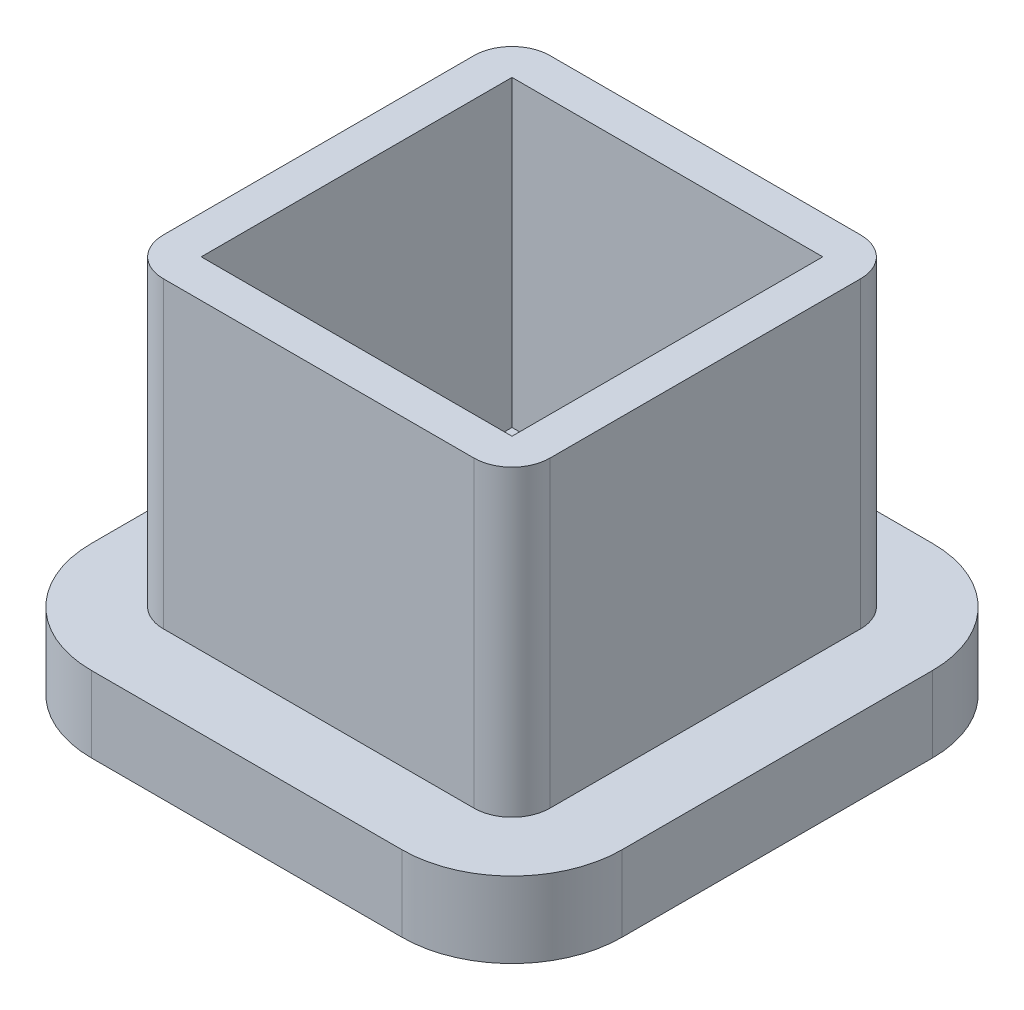
ISO-10303-21;
HEADER;
FILE_DESCRIPTION(('STEP AP214'),'2;1');
FILE_NAME('part.step','',(''),(''),'','','');
FILE_SCHEMA(('AUTOMOTIVE_DESIGN { 1 0 10303 214 1 1 1 1 }'));
ENDSEC;
DATA;
#1=APPLICATION_CONTEXT('core data for automotive mechanical design processes');
#2=APPLICATION_PROTOCOL_DEFINITION('international standard','automotive_design',2000,#1);
#3=PRODUCT_CONTEXT('',#1,'mechanical');
#4=PRODUCT('Part','Part','',(#3));
#5=PRODUCT_RELATED_PRODUCT_CATEGORY('part','',(#4));
#6=PRODUCT_DEFINITION_FORMATION('','',#4);
#7=PRODUCT_DEFINITION_CONTEXT('part definition',#1,'design');
#8=PRODUCT_DEFINITION('design','',#6,#7);
#9=PRODUCT_DEFINITION_SHAPE('','',#8);
#10=(LENGTH_UNIT() NAMED_UNIT(*) SI_UNIT(.MILLI.,.METRE.));
#11=(NAMED_UNIT(*) PLANE_ANGLE_UNIT() SI_UNIT($,.RADIAN.));
#12=(NAMED_UNIT(*) SI_UNIT($,.STERADIAN.) SOLID_ANGLE_UNIT());
#13=UNCERTAINTY_MEASURE_WITH_UNIT(LENGTH_MEASURE(1.E-05),#10,'distance_accuracy_value','');
#14=(GEOMETRIC_REPRESENTATION_CONTEXT(3) GLOBAL_UNCERTAINTY_ASSIGNED_CONTEXT((#13)) GLOBAL_UNIT_ASSIGNED_CONTEXT((#10,
#11,#12)) REPRESENTATION_CONTEXT('',''));
#15=CARTESIAN_POINT('',(0.,0.,0.));
#16=DIRECTION('',(0.,0.,1.));
#17=DIRECTION('',(1.,0.,0.));
#18=AXIS2_PLACEMENT_3D('',#15,#16,#17);
#19=CARTESIAN_POINT('',(0.,5.,0.));
#20=DIRECTION('',(0.,1.,0.));
#21=DIRECTION('',(0.,0.,1.));
#22=AXIS2_PLACEMENT_3D('',#19,#20,#21);
#23=PLANE('',#22);
#24=DIRECTION('',(0.,0.,1.));
#25=VECTOR('',#24,1.);
#26=CARTESIAN_POINT('',(-28.1933422806209,5.,24.5146348700407));
#27=LINE('',#26,#25);
#28=CARTESIAN_POINT('',(-28.1933422806209,5.,-3.23536512995933));
#29=VERTEX_POINT('',#28);
#30=CARTESIAN_POINT('',(-28.1933422806209,5.,17.2646348700407));
#31=VERTEX_POINT('',#30);
#32=EDGE_CURVE('E246',#29,#31,#27,.T.);
#33=ORIENTED_EDGE('',*,*,#32,.T.);
#34=CARTESIAN_POINT('',(-20.9433422806209,5.,17.2646348700407));
#35=DIRECTION('',(0.,1.,0.));
#36=DIRECTION('',(0.,0.,1.));
#37=AXIS2_PLACEMENT_3D('',#34,#35,#36);
#38=CIRCLE('',#37,7.25);
#39=CARTESIAN_POINT('',(-20.9433422806209,5.,24.5146348700407));
#40=VERTEX_POINT('',#39);
#41=EDGE_CURVE('E286',#31,#40,#38,.T.);
#42=ORIENTED_EDGE('',*,*,#41,.T.);
#43=DIRECTION('',(1.,0.,0.));
#44=VECTOR('',#43,1.);
#45=CARTESIAN_POINT('',(6.80665771937911,5.,24.5146348700407));
#46=LINE('',#45,#44);
#47=CARTESIAN_POINT('',(-0.443342280620896,5.,24.5146348700407));
#48=VERTEX_POINT('',#47);
#49=EDGE_CURVE('E249',#40,#48,#46,.T.);
#50=ORIENTED_EDGE('',*,*,#49,.T.);
#51=CARTESIAN_POINT('',(-0.443342280620896,5.,17.2646348700407));
#52=DIRECTION('',(0.,1.,0.));
#53=DIRECTION('',(0.,0.,1.));
#54=AXIS2_PLACEMENT_3D('',#51,#52,#53);
#55=CIRCLE('',#54,7.25);
#56=CARTESIAN_POINT('',(6.80665771937911,5.,17.2646348700407));
#57=VERTEX_POINT('',#56);
#58=EDGE_CURVE('E282',#48,#57,#55,.T.);
#59=ORIENTED_EDGE('',*,*,#58,.T.);
#60=DIRECTION('',(0.,0.,-1.));
#61=VECTOR('',#60,1.);
#62=CARTESIAN_POINT('',(6.80665771937911,5.,24.5146348700407));
#63=LINE('',#62,#61);
#64=CARTESIAN_POINT('',(6.80665771937911,5.,-3.23536512995933));
#65=VERTEX_POINT('',#64);
#66=EDGE_CURVE('E239',#57,#65,#63,.T.);
#67=ORIENTED_EDGE('',*,*,#66,.T.);
#68=CARTESIAN_POINT('',(-0.443342280620896,5.,-3.23536512995933));
#69=DIRECTION('',(0.,1.,0.));
#70=DIRECTION('',(0.,0.,1.));
#71=AXIS2_PLACEMENT_3D('',#68,#69,#70);
#72=CIRCLE('',#71,7.25);
#73=CARTESIAN_POINT('',(-0.443342280620896,5.,-10.4853651299593));
#74=VERTEX_POINT('',#73);
#75=EDGE_CURVE('E280',#65,#74,#72,.T.);
#76=ORIENTED_EDGE('',*,*,#75,.T.);
#77=DIRECTION('',(-1.,0.,0.));
#78=VECTOR('',#77,1.);
#79=CARTESIAN_POINT('',(6.80665771937911,5.,-10.4853651299593));
#80=LINE('',#79,#78);
#81=CARTESIAN_POINT('',(-20.9433422806209,5.,-10.4853651299593));
#82=VERTEX_POINT('',#81);
#83=EDGE_CURVE('E242',#74,#82,#80,.T.);
#84=ORIENTED_EDGE('',*,*,#83,.T.);
#85=CARTESIAN_POINT('',(-20.9433422806209,5.,-3.23536512995933));
#86=DIRECTION('',(0.,1.,0.));
#87=DIRECTION('',(0.,0.,1.));
#88=AXIS2_PLACEMENT_3D('',#85,#86,#87);
#89=CIRCLE('',#88,7.25);
#90=EDGE_CURVE('E284',#82,#29,#89,.T.);
#91=ORIENTED_EDGE('',*,*,#90,.T.);
#92=EDGE_LOOP('',(#33,#42,#50,#59,#67,#76,#84,#91));
#93=FACE_BOUND('',#92,.T.);
#94=DIRECTION('',(1.,0.,0.));
#95=VECTOR('',#94,1.);
#96=CARTESIAN_POINT('',(-23.4433422806209,5.,19.7646348700407));
#97=LINE('',#96,#95);
#98=CARTESIAN_POINT('',(-20.9433422806209,5.,19.7646348700407));
#99=VERTEX_POINT('',#98);
#100=CARTESIAN_POINT('',(-0.44334228062089,5.,19.7646348700407));
#101=VERTEX_POINT('',#100);
#102=EDGE_CURVE('E232',#99,#101,#97,.T.);
#103=ORIENTED_EDGE('',*,*,#102,.F.);
#104=CARTESIAN_POINT('',(-20.9433422806209,5.,17.2646348700407));
#105=DIRECTION('',(0.,1.,0.));
#106=DIRECTION('',(0.,0.,1.));
#107=AXIS2_PLACEMENT_3D('',#104,#105,#106);
#108=CIRCLE('',#107,2.5);
#109=CARTESIAN_POINT('',(-23.4433422806209,5.,17.2646348700407));
#110=VERTEX_POINT('',#109);
#111=EDGE_CURVE('E325',#99,#110,#108,.F.);
#112=ORIENTED_EDGE('',*,*,#111,.T.);
#113=DIRECTION('',(0.,0.,1.));
#114=VECTOR('',#113,1.);
#115=CARTESIAN_POINT('',(-23.4433422806209,5.,-5.73536512995933));
#116=LINE('',#115,#114);
#117=CARTESIAN_POINT('',(-23.4433422806209,5.,-3.23536512995933));
#118=VERTEX_POINT('',#117);
#119=EDGE_CURVE('E193',#118,#110,#116,.T.);
#120=ORIENTED_EDGE('',*,*,#119,.F.);
#121=CARTESIAN_POINT('',(-20.9433422806209,5.,-3.23536512995933));
#122=DIRECTION('',(0.,1.,0.));
#123=DIRECTION('',(0.,0.,1.));
#124=AXIS2_PLACEMENT_3D('',#121,#122,#123);
#125=CIRCLE('',#124,2.5);
#126=CARTESIAN_POINT('',(-20.9433422806209,5.,-5.73536512995933));
#127=VERTEX_POINT('',#126);
#128=EDGE_CURVE('E11',#118,#127,#125,.F.);
#129=ORIENTED_EDGE('',*,*,#128,.T.);
#130=DIRECTION('',(-1.,0.,0.));
#131=VECTOR('',#130,1.);
#132=CARTESIAN_POINT('',(-23.4433422806209,5.,-5.73536512995933));
#133=LINE('',#132,#131);
#134=CARTESIAN_POINT('',(-0.443342280620894,5.,-5.73536512995933));
#135=VERTEX_POINT('',#134);
#136=EDGE_CURVE('E220',#135,#127,#133,.T.);
#137=ORIENTED_EDGE('',*,*,#136,.F.);
#138=CARTESIAN_POINT('',(-0.443342280620894,5.,-3.23536512995933));
#139=DIRECTION('',(0.,1.,0.));
#140=DIRECTION('',(0.,0.,1.));
#141=AXIS2_PLACEMENT_3D('',#138,#139,#140);
#142=CIRCLE('',#141,2.5);
#143=CARTESIAN_POINT('',(2.05665771937911,5.,-3.23536512995933));
#144=VERTEX_POINT('',#143);
#145=EDGE_CURVE('E45',#135,#144,#142,.F.);
#146=ORIENTED_EDGE('',*,*,#145,.T.);
#147=DIRECTION('',(0.,0.,-1.));
#148=VECTOR('',#147,1.);
#149=CARTESIAN_POINT('',(2.0566577193791,5.,-5.73536512995933));
#150=LINE('',#149,#148);
#151=CARTESIAN_POINT('',(2.05665771937911,5.,17.2646348700407));
#152=VERTEX_POINT('',#151);
#153=EDGE_CURVE('E235',#152,#144,#150,.T.);
#154=ORIENTED_EDGE('',*,*,#153,.F.);
#155=CARTESIAN_POINT('',(-0.443342280620892,5.,17.2646348700407));
#156=DIRECTION('',(0.,1.,0.));
#157=DIRECTION('',(0.,0.,1.));
#158=AXIS2_PLACEMENT_3D('',#155,#156,#157);
#159=CIRCLE('',#158,2.5);
#160=EDGE_CURVE('E327',#152,#101,#159,.F.);
#161=ORIENTED_EDGE('',*,*,#160,.T.);
#162=EDGE_LOOP('',(#103,#112,#120,#129,#137,#146,#154,#161));
#163=FACE_BOUND('',#162,.T.);
#164=ADVANCED_FACE('F37',(#93,#163),#23,.T.);
#165=CARTESIAN_POINT('',(6.80665771937911,5.,24.5146348700407));
#166=DIRECTION('',(-1.,0.,0.));
#167=DIRECTION('',(0.,0.,1.));
#168=AXIS2_PLACEMENT_3D('',#165,#166,#167);
#169=PLANE('',#168);
#170=ORIENTED_EDGE('',*,*,#66,.F.);
#171=DIRECTION('',(0.,-1.,0.));
#172=VECTOR('',#171,1.);
#173=CARTESIAN_POINT('',(6.80665771937911,5.,17.2646348700407));
#174=LINE('',#173,#172);
#175=CARTESIAN_POINT('',(6.80665771937911,0.,17.2646348700407));
#176=VERTEX_POINT('',#175);
#177=EDGE_CURVE('E295',#57,#176,#174,.T.);
#178=ORIENTED_EDGE('',*,*,#177,.T.);
#179=DIRECTION('',(0.,0.,-1.));
#180=VECTOR('',#179,1.);
#181=CARTESIAN_POINT('',(6.80665771937911,0.,24.5146348700407));
#182=LINE('',#181,#180);
#183=CARTESIAN_POINT('',(6.80665771937911,0.,-3.23536512995933));
#184=VERTEX_POINT('',#183);
#185=EDGE_CURVE('E229',#176,#184,#182,.T.);
#186=ORIENTED_EDGE('',*,*,#185,.T.);
#187=DIRECTION('',(0.,-1.,0.));
#188=VECTOR('',#187,1.);
#189=CARTESIAN_POINT('',(6.80665771937911,5.,-3.23536512995933));
#190=LINE('',#189,#188);
#191=EDGE_CURVE('E293',#184,#65,#190,.F.);
#192=ORIENTED_EDGE('',*,*,#191,.T.);
#193=EDGE_LOOP('',(#170,#178,#186,#192));
#194=FACE_BOUND('',#193,.T.);
#195=ADVANCED_FACE('F368',(#194),#169,.F.);
#196=CARTESIAN_POINT('',(6.80665771937911,5.,-10.4853651299593));
#197=DIRECTION('',(0.,0.,1.));
#198=DIRECTION('',(1.,0.,0.));
#199=AXIS2_PLACEMENT_3D('',#196,#197,#198);
#200=PLANE('',#199);
#201=DIRECTION('',(-1.,0.,0.));
#202=VECTOR('',#201,1.);
#203=CARTESIAN_POINT('',(6.80665771937911,0.,-10.4853651299593));
#204=LINE('',#203,#202);
#205=CARTESIAN_POINT('',(-0.443342280620896,0.,-10.4853651299593));
#206=VERTEX_POINT('',#205);
#207=CARTESIAN_POINT('',(-20.9433422806209,0.,-10.4853651299593));
#208=VERTEX_POINT('',#207);
#209=EDGE_CURVE('E255',#206,#208,#204,.T.);
#210=ORIENTED_EDGE('',*,*,#209,.T.);
#211=DIRECTION('',(0.,-1.,0.));
#212=VECTOR('',#211,1.);
#213=CARTESIAN_POINT('',(-20.9433422806209,5.,-10.4853651299593));
#214=LINE('',#213,#212);
#215=EDGE_CURVE('E291',#208,#82,#214,.F.);
#216=ORIENTED_EDGE('',*,*,#215,.T.);
#217=ORIENTED_EDGE('',*,*,#83,.F.);
#218=DIRECTION('',(0.,-1.,0.));
#219=VECTOR('',#218,1.);
#220=CARTESIAN_POINT('',(-0.443342280620896,5.,-10.4853651299593));
#221=LINE('',#220,#219);
#222=EDGE_CURVE('E288',#74,#206,#221,.T.);
#223=ORIENTED_EDGE('',*,*,#222,.T.);
#224=EDGE_LOOP('',(#210,#216,#217,#223));
#225=FACE_BOUND('',#224,.T.);
#226=ADVANCED_FACE('F375',(#225),#200,.F.);
#227=CARTESIAN_POINT('',(-28.1933422806209,5.,24.5146348700407));
#228=DIRECTION('',(1.,0.,0.));
#229=DIRECTION('',(0.,0.,-1.));
#230=AXIS2_PLACEMENT_3D('',#227,#228,#229);
#231=PLANE('',#230);
#232=DIRECTION('',(0.,0.,1.));
#233=VECTOR('',#232,1.);
#234=CARTESIAN_POINT('',(-28.1933422806209,0.,24.5146348700407));
#235=LINE('',#234,#233);
#236=CARTESIAN_POINT('',(-28.1933422806209,0.,-3.23536512995933));
#237=VERTEX_POINT('',#236);
#238=CARTESIAN_POINT('',(-28.1933422806209,0.,17.2646348700407));
#239=VERTEX_POINT('',#238);
#240=EDGE_CURVE('E258',#237,#239,#235,.T.);
#241=ORIENTED_EDGE('',*,*,#240,.T.);
#242=DIRECTION('',(0.,-1.,0.));
#243=VECTOR('',#242,1.);
#244=CARTESIAN_POINT('',(-28.1933422806209,5.,17.2646348700407));
#245=LINE('',#244,#243);
#246=EDGE_CURVE('E278',#239,#31,#245,.F.);
#247=ORIENTED_EDGE('',*,*,#246,.T.);
#248=ORIENTED_EDGE('',*,*,#32,.F.);
#249=DIRECTION('',(0.,-1.,0.));
#250=VECTOR('',#249,1.);
#251=CARTESIAN_POINT('',(-28.1933422806209,5.,-3.23536512995933));
#252=LINE('',#251,#250);
#253=EDGE_CURVE('E275',#29,#237,#252,.T.);
#254=ORIENTED_EDGE('',*,*,#253,.T.);
#255=EDGE_LOOP('',(#241,#247,#248,#254));
#256=FACE_BOUND('',#255,.T.);
#257=ADVANCED_FACE('F473',(#256),#231,.F.);
#258=CARTESIAN_POINT('',(6.80665771937911,5.,24.5146348700407));
#259=DIRECTION('',(0.,0.,-1.));
#260=DIRECTION('',(-1.,0.,0.));
#261=AXIS2_PLACEMENT_3D('',#258,#259,#260);
#262=PLANE('',#261);
#263=ORIENTED_EDGE('',*,*,#49,.F.);
#264=DIRECTION('',(0.,-1.,0.));
#265=VECTOR('',#264,1.);
#266=CARTESIAN_POINT('',(-20.9433422806209,5.,24.5146348700407));
#267=LINE('',#266,#265);
#268=CARTESIAN_POINT('',(-20.9433422806209,0.,24.5146348700407));
#269=VERTEX_POINT('',#268);
#270=EDGE_CURVE('E264',#40,#269,#267,.T.);
#271=ORIENTED_EDGE('',*,*,#270,.T.);
#272=DIRECTION('',(1.,0.,0.));
#273=VECTOR('',#272,1.);
#274=CARTESIAN_POINT('',(6.80665771937911,0.,24.5146348700407));
#275=LINE('',#274,#273);
#276=CARTESIAN_POINT('',(-0.443342280620896,0.,24.5146348700407));
#277=VERTEX_POINT('',#276);
#278=EDGE_CURVE('E243',#269,#277,#275,.T.);
#279=ORIENTED_EDGE('',*,*,#278,.T.);
#280=DIRECTION('',(0.,-1.,0.));
#281=VECTOR('',#280,1.);
#282=CARTESIAN_POINT('',(-0.443342280620896,5.,24.5146348700407));
#283=LINE('',#282,#281);
#284=EDGE_CURVE('E252',#277,#48,#283,.F.);
#285=ORIENTED_EDGE('',*,*,#284,.T.);
#286=EDGE_LOOP('',(#263,#271,#279,#285));
#287=FACE_BOUND('',#286,.T.);
#288=ADVANCED_FACE('F483',(#287),#262,.F.);
#289=CARTESIAN_POINT('',(0.,0.,0.));
#290=DIRECTION('',(0.,1.,0.));
#291=DIRECTION('',(0.,0.,1.));
#292=AXIS2_PLACEMENT_3D('',#289,#290,#291);
#293=PLANE('',#292);
#294=ORIENTED_EDGE('',*,*,#278,.F.);
#295=CARTESIAN_POINT('',(-20.9433422806209,0.,17.2646348700407));
#296=DIRECTION('',(0.,1.,0.));
#297=DIRECTION('',(0.,0.,1.));
#298=AXIS2_PLACEMENT_3D('',#295,#296,#297);
#299=CIRCLE('',#298,7.25);
#300=EDGE_CURVE('E273',#269,#239,#299,.F.);
#301=ORIENTED_EDGE('',*,*,#300,.T.);
#302=ORIENTED_EDGE('',*,*,#240,.F.);
#303=CARTESIAN_POINT('',(-20.9433422806209,0.,-3.23536512995933));
#304=DIRECTION('',(0.,1.,0.));
#305=DIRECTION('',(0.,0.,1.));
#306=AXIS2_PLACEMENT_3D('',#303,#304,#305);
#307=CIRCLE('',#306,7.25);
#308=EDGE_CURVE('E271',#237,#208,#307,.F.);
#309=ORIENTED_EDGE('',*,*,#308,.T.);
#310=ORIENTED_EDGE('',*,*,#209,.F.);
#311=CARTESIAN_POINT('',(-0.443342280620896,0.,-3.23536512995933));
#312=DIRECTION('',(0.,1.,0.));
#313=DIRECTION('',(0.,0.,1.));
#314=AXIS2_PLACEMENT_3D('',#311,#312,#313);
#315=CIRCLE('',#314,7.25);
#316=EDGE_CURVE('E267',#206,#184,#315,.F.);
#317=ORIENTED_EDGE('',*,*,#316,.T.);
#318=ORIENTED_EDGE('',*,*,#185,.F.);
#319=CARTESIAN_POINT('',(-0.443342280620896,0.,17.2646348700407));
#320=DIRECTION('',(0.,1.,0.));
#321=DIRECTION('',(0.,0.,1.));
#322=AXIS2_PLACEMENT_3D('',#319,#320,#321);
#323=CIRCLE('',#322,7.25);
#324=EDGE_CURVE('E269',#176,#277,#323,.F.);
#325=ORIENTED_EDGE('',*,*,#324,.T.);
#326=EDGE_LOOP('',(#294,#301,#302,#309,#310,#317,#318,#325));
#327=FACE_BOUND('',#326,.T.);
#328=ADVANCED_FACE('F408',(#327),#293,.F.);
#329=CARTESIAN_POINT('',(0.,25.,0.));
#330=DIRECTION('',(0.,1.,0.));
#331=DIRECTION('',(0.,0.,1.));
#332=AXIS2_PLACEMENT_3D('',#329,#330,#331);
#333=PLANE('',#332);
#334=DIRECTION('',(0.,0.,1.));
#335=VECTOR('',#334,1.);
#336=CARTESIAN_POINT('',(-23.4433422806209,25.,-5.73536512995933));
#337=LINE('',#336,#335);
#338=CARTESIAN_POINT('',(-23.4433422806209,25.,-3.23536512995933));
#339=VERTEX_POINT('',#338);
#340=CARTESIAN_POINT('',(-23.4433422806209,25.,17.2646348700407));
#341=VERTEX_POINT('',#340);
#342=EDGE_CURVE('E216',#339,#341,#337,.T.);
#343=ORIENTED_EDGE('',*,*,#342,.T.);
#344=CARTESIAN_POINT('',(-20.9433422806209,25.,17.2646348700407));
#345=DIRECTION('',(0.,1.,0.));
#346=DIRECTION('',(0.,0.,1.));
#347=AXIS2_PLACEMENT_3D('',#344,#345,#346);
#348=CIRCLE('',#347,2.5);
#349=CARTESIAN_POINT('',(-20.9433422806209,25.,19.7646348700407));
#350=VERTEX_POINT('',#349);
#351=EDGE_CURVE('E314',#341,#350,#348,.T.);
#352=ORIENTED_EDGE('',*,*,#351,.T.);
#353=DIRECTION('',(1.,0.,0.));
#354=VECTOR('',#353,1.);
#355=CARTESIAN_POINT('',(-23.4433422806209,25.,19.7646348700407));
#356=LINE('',#355,#354);
#357=CARTESIAN_POINT('',(-0.44334228062089,25.,19.7646348700407));
#358=VERTEX_POINT('',#357);
#359=EDGE_CURVE('E219',#350,#358,#356,.T.);
#360=ORIENTED_EDGE('',*,*,#359,.T.);
#361=CARTESIAN_POINT('',(-0.443342280620892,25.,17.2646348700407));
#362=DIRECTION('',(0.,1.,0.));
#363=DIRECTION('',(0.,0.,1.));
#364=AXIS2_PLACEMENT_3D('',#361,#362,#363);
#365=CIRCLE('',#364,2.5);
#366=CARTESIAN_POINT('',(2.05665771937911,25.,17.2646348700407));
#367=VERTEX_POINT('',#366);
#368=EDGE_CURVE('E312',#358,#367,#365,.T.);
#369=ORIENTED_EDGE('',*,*,#368,.T.);
#370=DIRECTION('',(0.,0.,-1.));
#371=VECTOR('',#370,1.);
#372=CARTESIAN_POINT('',(2.0566577193791,25.,-5.73536512995933));
#373=LINE('',#372,#371);
#374=CARTESIAN_POINT('',(2.05665771937911,25.,-3.23536512995933));
#375=VERTEX_POINT('',#374);
#376=EDGE_CURVE('E223',#367,#375,#373,.T.);
#377=ORIENTED_EDGE('',*,*,#376,.T.);
#378=CARTESIAN_POINT('',(-0.443342280620894,25.,-3.23536512995933));
#379=DIRECTION('',(0.,1.,0.));
#380=DIRECTION('',(0.,0.,1.));
#381=AXIS2_PLACEMENT_3D('',#378,#379,#380);
#382=CIRCLE('',#381,2.5);
#383=CARTESIAN_POINT('',(-0.443342280620894,25.,-5.73536512995933));
#384=VERTEX_POINT('',#383);
#385=EDGE_CURVE('E310',#375,#384,#382,.T.);
#386=ORIENTED_EDGE('',*,*,#385,.T.);
#387=DIRECTION('',(-1.,0.,0.));
#388=VECTOR('',#387,1.);
#389=CARTESIAN_POINT('',(-23.4433422806209,25.,-5.73536512995933));
#390=LINE('',#389,#388);
#391=CARTESIAN_POINT('',(-20.9433422806209,25.,-5.73536512995933));
#392=VERTEX_POINT('',#391);
#393=EDGE_CURVE('E226',#384,#392,#390,.T.);
#394=ORIENTED_EDGE('',*,*,#393,.T.);
#395=CARTESIAN_POINT('',(-20.9433422806209,25.,-3.23536512995933));
#396=DIRECTION('',(0.,1.,0.));
#397=DIRECTION('',(0.,0.,1.));
#398=AXIS2_PLACEMENT_3D('',#395,#396,#397);
#399=CIRCLE('',#398,2.5);
#400=EDGE_CURVE('E308',#392,#339,#399,.T.);
#401=ORIENTED_EDGE('',*,*,#400,.T.);
#402=EDGE_LOOP('',(#343,#352,#360,#369,#377,#386,#394,#401));
#403=FACE_BOUND('',#402,.T.);
#404=DIRECTION('',(1.,0.,0.));
#405=VECTOR('',#404,1.);
#406=CARTESIAN_POINT('',(-20.9433422806209,25.,17.2646348700407));
#407=LINE('',#406,#405);
#408=CARTESIAN_POINT('',(-20.9433422806209,25.,17.2646348700407));
#409=VERTEX_POINT('',#408);
#410=CARTESIAN_POINT('',(-0.443342280620894,25.,17.2646348700407));
#411=VERTEX_POINT('',#410);
#412=EDGE_CURVE('E184',#409,#411,#407,.T.);
#413=ORIENTED_EDGE('',*,*,#412,.F.);
#414=DIRECTION('',(0.,0.,1.));
#415=VECTOR('',#414,1.);
#416=CARTESIAN_POINT('',(-20.9433422806209,25.,-3.23536512995933));
#417=LINE('',#416,#415);
#418=CARTESIAN_POINT('',(-20.9433422806209,25.,-3.23536512995933));
#419=VERTEX_POINT('',#418);
#420=EDGE_CURVE('E174',#419,#409,#417,.T.);
#421=ORIENTED_EDGE('',*,*,#420,.F.);
#422=DIRECTION('',(-1.,0.,0.));
#423=VECTOR('',#422,1.);
#424=CARTESIAN_POINT('',(-20.9433422806209,25.,-3.23536512995933));
#425=LINE('',#424,#423);
#426=CARTESIAN_POINT('',(-0.443342280620894,25.,-3.23536512995933));
#427=VERTEX_POINT('',#426);
#428=EDGE_CURVE('E201',#427,#419,#425,.T.);
#429=ORIENTED_EDGE('',*,*,#428,.F.);
#430=DIRECTION('',(0.,0.,-1.));
#431=VECTOR('',#430,1.);
#432=CARTESIAN_POINT('',(-0.443342280620894,25.,-3.23536512995933));
#433=LINE('',#432,#431);
#434=EDGE_CURVE('E199',#411,#427,#433,.T.);
#435=ORIENTED_EDGE('',*,*,#434,.F.);
#436=EDGE_LOOP('',(#413,#421,#429,#435));
#437=FACE_BOUND('',#436,.T.);
#438=ADVANCED_FACE('F197',(#403,#437),#333,.T.);
#439=CARTESIAN_POINT('',(-23.4433422806209,25.,-5.73536512995933));
#440=DIRECTION('',(1.,0.,0.));
#441=DIRECTION('',(0.,0.,-1.));
#442=AXIS2_PLACEMENT_3D('',#439,#440,#441);
#443=PLANE('',#442);
#444=ORIENTED_EDGE('',*,*,#119,.T.);
#445=DIRECTION('',(0.,-1.,0.));
#446=VECTOR('',#445,1.);
#447=CARTESIAN_POINT('',(-23.4433422806209,25.,17.2646348700407));
#448=LINE('',#447,#446);
#449=EDGE_CURVE('E306',#110,#341,#448,.F.);
#450=ORIENTED_EDGE('',*,*,#449,.T.);
#451=ORIENTED_EDGE('',*,*,#342,.F.);
#452=DIRECTION('',(0.,-1.,0.));
#453=VECTOR('',#452,1.);
#454=CARTESIAN_POINT('',(-23.4433422806209,25.,-3.23536512995933));
#455=LINE('',#454,#453);
#456=EDGE_CURVE('E303',#339,#118,#455,.T.);
#457=ORIENTED_EDGE('',*,*,#456,.T.);
#458=EDGE_LOOP('',(#444,#450,#451,#457));
#459=FACE_BOUND('',#458,.T.);
#460=ADVANCED_FACE('F347',(#459),#443,.F.);
#461=CARTESIAN_POINT('',(-23.4433422806209,25.,19.7646348700407));
#462=DIRECTION('',(0.,0.,-1.));
#463=DIRECTION('',(-1.,0.,0.));
#464=AXIS2_PLACEMENT_3D('',#461,#462,#463);
#465=PLANE('',#464);
#466=ORIENTED_EDGE('',*,*,#359,.F.);
#467=DIRECTION('',(0.,-1.,0.));
#468=VECTOR('',#467,1.);
#469=CARTESIAN_POINT('',(-20.9433422806209,25.,19.7646348700407));
#470=LINE('',#469,#468);
#471=EDGE_CURVE('E300',#350,#99,#470,.T.);
#472=ORIENTED_EDGE('',*,*,#471,.T.);
#473=ORIENTED_EDGE('',*,*,#102,.T.);
#474=DIRECTION('',(0.,-1.,0.));
#475=VECTOR('',#474,1.);
#476=CARTESIAN_POINT('',(-0.44334228062089,25.,19.7646348700407));
#477=LINE('',#476,#475);
#478=EDGE_CURVE('E298',#101,#358,#477,.F.);
#479=ORIENTED_EDGE('',*,*,#478,.T.);
#480=EDGE_LOOP('',(#466,#472,#473,#479));
#481=FACE_BOUND('',#480,.T.);
#482=ADVANCED_FACE('F355',(#481),#465,.F.);
#483=CARTESIAN_POINT('',(2.0566577193791,25.,-5.73536512995933));
#484=DIRECTION('',(-1.,0.,0.));
#485=DIRECTION('',(0.,0.,1.));
#486=AXIS2_PLACEMENT_3D('',#483,#484,#485);
#487=PLANE('',#486);
#488=ORIENTED_EDGE('',*,*,#376,.F.);
#489=DIRECTION('',(0.,-1.,0.));
#490=VECTOR('',#489,1.);
#491=CARTESIAN_POINT('',(2.05665771937911,25.,17.2646348700407));
#492=LINE('',#491,#490);
#493=EDGE_CURVE('E318',#367,#152,#492,.T.);
#494=ORIENTED_EDGE('',*,*,#493,.T.);
#495=ORIENTED_EDGE('',*,*,#153,.T.);
#496=DIRECTION('',(0.,-1.,0.));
#497=VECTOR('',#496,1.);
#498=CARTESIAN_POINT('',(2.05665771937911,25.,-3.23536512995933));
#499=LINE('',#498,#497);
#500=EDGE_CURVE('E316',#144,#375,#499,.F.);
#501=ORIENTED_EDGE('',*,*,#500,.T.);
#502=EDGE_LOOP('',(#488,#494,#495,#501));
#503=FACE_BOUND('',#502,.T.);
#504=ADVANCED_FACE('F332',(#503),#487,.F.);
#505=CARTESIAN_POINT('',(-23.4433422806209,25.,-5.73536512995933));
#506=DIRECTION('',(0.,0.,1.));
#507=DIRECTION('',(1.,0.,0.));
#508=AXIS2_PLACEMENT_3D('',#505,#506,#507);
#509=PLANE('',#508);
#510=ORIENTED_EDGE('',*,*,#393,.F.);
#511=DIRECTION('',(0.,-1.,0.));
#512=VECTOR('',#511,1.);
#513=CARTESIAN_POINT('',(-0.443342280620894,25.,-5.73536512995933));
#514=LINE('',#513,#512);
#515=EDGE_CURVE('E323',#384,#135,#514,.T.);
#516=ORIENTED_EDGE('',*,*,#515,.T.);
#517=ORIENTED_EDGE('',*,*,#136,.T.);
#518=DIRECTION('',(0.,-1.,0.));
#519=VECTOR('',#518,1.);
#520=CARTESIAN_POINT('',(-20.9433422806209,25.,-5.73536512995933));
#521=LINE('',#520,#519);
#522=EDGE_CURVE('E321',#127,#392,#521,.F.);
#523=ORIENTED_EDGE('',*,*,#522,.T.);
#524=EDGE_LOOP('',(#510,#516,#517,#523));
#525=FACE_BOUND('',#524,.T.);
#526=ADVANCED_FACE('F340',(#525),#509,.F.);
#527=CARTESIAN_POINT('',(-20.9433422806209,25.,-3.23536512995933));
#528=DIRECTION('',(1.,0.,0.));
#529=DIRECTION('',(0.,0.,-1.));
#530=AXIS2_PLACEMENT_3D('',#527,#528,#529);
#531=PLANE('',#530);
#532=DIRECTION('',(0.,0.,1.));
#533=VECTOR('',#532,1.);
#534=CARTESIAN_POINT('',(-20.9433422806209,5.,-3.23536512995933));
#535=LINE('',#534,#533);
#536=CARTESIAN_POINT('',(-20.9433422806209,5.,-3.23536512995933));
#537=VERTEX_POINT('',#536);
#538=CARTESIAN_POINT('',(-20.9433422806209,5.,17.2646348700407));
#539=VERTEX_POINT('',#538);
#540=EDGE_CURVE('E205',#537,#539,#535,.T.);
#541=ORIENTED_EDGE('',*,*,#540,.F.);
#542=DIRECTION('',(0.,-1.,0.));
#543=VECTOR('',#542,1.);
#544=CARTESIAN_POINT('',(-20.9433422806209,25.,-3.23536512995933));
#545=LINE('',#544,#543);
#546=EDGE_CURVE('E180',#419,#537,#545,.T.);
#547=ORIENTED_EDGE('',*,*,#546,.F.);
#548=ORIENTED_EDGE('',*,*,#420,.T.);
#549=DIRECTION('',(0.,-1.,0.));
#550=VECTOR('',#549,1.);
#551=CARTESIAN_POINT('',(-20.9433422806209,25.,17.2646348700407));
#552=LINE('',#551,#550);
#553=EDGE_CURVE('E178',#409,#539,#552,.T.);
#554=ORIENTED_EDGE('',*,*,#553,.T.);
#555=EDGE_LOOP('',(#541,#547,#548,#554));
#556=FACE_BOUND('',#555,.T.);
#557=ADVANCED_FACE('F177',(#556),#531,.T.);
#558=CARTESIAN_POINT('',(-20.9433422806209,25.,17.2646348700407));
#559=DIRECTION('',(0.,0.,-1.));
#560=DIRECTION('',(-1.,0.,0.));
#561=AXIS2_PLACEMENT_3D('',#558,#559,#560);
#562=PLANE('',#561);
#563=DIRECTION('',(1.,0.,0.));
#564=VECTOR('',#563,1.);
#565=CARTESIAN_POINT('',(-20.9433422806209,5.,17.2646348700407));
#566=LINE('',#565,#564);
#567=CARTESIAN_POINT('',(-0.443342280620894,5.,17.2646348700407));
#568=VERTEX_POINT('',#567);
#569=EDGE_CURVE('E192',#539,#568,#566,.T.);
#570=ORIENTED_EDGE('',*,*,#569,.F.);
#571=ORIENTED_EDGE('',*,*,#553,.F.);
#572=ORIENTED_EDGE('',*,*,#412,.T.);
#573=DIRECTION('',(0.,-1.,0.));
#574=VECTOR('',#573,1.);
#575=CARTESIAN_POINT('',(-0.443342280620894,25.,17.2646348700407));
#576=LINE('',#575,#574);
#577=EDGE_CURVE('E194',#411,#568,#576,.T.);
#578=ORIENTED_EDGE('',*,*,#577,.T.);
#579=EDGE_LOOP('',(#570,#571,#572,#578));
#580=FACE_BOUND('',#579,.T.);
#581=ADVANCED_FACE('F189',(#580),#562,.T.);
#582=CARTESIAN_POINT('',(-0.443342280620894,25.,-3.23536512995933));
#583=DIRECTION('',(-1.,0.,0.));
#584=DIRECTION('',(0.,0.,1.));
#585=AXIS2_PLACEMENT_3D('',#582,#583,#584);
#586=PLANE('',#585);
#587=DIRECTION('',(0.,0.,-1.));
#588=VECTOR('',#587,1.);
#589=CARTESIAN_POINT('',(-0.443342280620894,5.,-3.23536512995933));
#590=LINE('',#589,#588);
#591=CARTESIAN_POINT('',(-0.443342280620894,5.,-3.23536512995933));
#592=VERTEX_POINT('',#591);
#593=EDGE_CURVE('E208',#568,#592,#590,.T.);
#594=ORIENTED_EDGE('',*,*,#593,.F.);
#595=ORIENTED_EDGE('',*,*,#577,.F.);
#596=ORIENTED_EDGE('',*,*,#434,.T.);
#597=DIRECTION('',(0.,-1.,0.));
#598=VECTOR('',#597,1.);
#599=CARTESIAN_POINT('',(-0.443342280620894,25.,-3.23536512995933));
#600=LINE('',#599,#598);
#601=EDGE_CURVE('E212',#427,#592,#600,.T.);
#602=ORIENTED_EDGE('',*,*,#601,.T.);
#603=EDGE_LOOP('',(#594,#595,#596,#602));
#604=FACE_BOUND('',#603,.T.);
#605=ADVANCED_FACE('F391',(#604),#586,.T.);
#606=CARTESIAN_POINT('',(-20.9433422806209,25.,-3.23536512995933));
#607=DIRECTION('',(0.,0.,1.));
#608=DIRECTION('',(1.,0.,0.));
#609=AXIS2_PLACEMENT_3D('',#606,#607,#608);
#610=PLANE('',#609);
#611=DIRECTION('',(-1.,0.,0.));
#612=VECTOR('',#611,1.);
#613=CARTESIAN_POINT('',(-20.9433422806209,5.,-3.23536512995933));
#614=LINE('',#613,#612);
#615=EDGE_CURVE('E185',#592,#537,#614,.T.);
#616=ORIENTED_EDGE('',*,*,#615,.F.);
#617=ORIENTED_EDGE('',*,*,#601,.F.);
#618=ORIENTED_EDGE('',*,*,#428,.T.);
#619=ORIENTED_EDGE('',*,*,#546,.T.);
#620=EDGE_LOOP('',(#616,#617,#618,#619));
#621=FACE_BOUND('',#620,.T.);
#622=ADVANCED_FACE('F382',(#621),#610,.T.);
#623=ORIENTED_EDGE('',*,*,#540,.T.);
#624=ORIENTED_EDGE('',*,*,#569,.T.);
#625=ORIENTED_EDGE('',*,*,#593,.T.);
#626=ORIENTED_EDGE('',*,*,#615,.T.);
#627=EDGE_LOOP('',(#623,#624,#625,#626));
#628=FACE_BOUND('',#627,.T.);
#629=ADVANCED_FACE('F371',(#628),#23,.T.);
#630=CARTESIAN_POINT('',(-20.9433422806209,5.,17.2646348700407));
#631=DIRECTION('',(0.,-1.,0.));
#632=DIRECTION('',(0.,0.,-1.));
#633=AXIS2_PLACEMENT_3D('',#630,#631,#632);
#634=CYLINDRICAL_SURFACE('',#633,7.25);
#635=ORIENTED_EDGE('',*,*,#41,.F.);
#636=ORIENTED_EDGE('',*,*,#246,.F.);
#637=ORIENTED_EDGE('',*,*,#300,.F.);
#638=ORIENTED_EDGE('',*,*,#270,.F.);
#639=EDGE_LOOP('',(#635,#636,#637,#638));
#640=FACE_BOUND('',#639,.T.);
#641=ADVANCED_FACE('F381',(#640),#634,.T.);
#642=CARTESIAN_POINT('',(-20.9433422806209,5.,-3.23536512995933));
#643=DIRECTION('',(0.,-1.,0.));
#644=DIRECTION('',(0.,0.,-1.));
#645=AXIS2_PLACEMENT_3D('',#642,#643,#644);
#646=CYLINDRICAL_SURFACE('',#645,7.25);
#647=ORIENTED_EDGE('',*,*,#90,.F.);
#648=ORIENTED_EDGE('',*,*,#215,.F.);
#649=ORIENTED_EDGE('',*,*,#308,.F.);
#650=ORIENTED_EDGE('',*,*,#253,.F.);
#651=EDGE_LOOP('',(#647,#648,#649,#650));
#652=FACE_BOUND('',#651,.T.);
#653=ADVANCED_FACE('F388',(#652),#646,.T.);
#654=CARTESIAN_POINT('',(-0.443342280620896,5.,17.2646348700407));
#655=DIRECTION('',(0.,-1.,0.));
#656=DIRECTION('',(0.,0.,-1.));
#657=AXIS2_PLACEMENT_3D('',#654,#655,#656);
#658=CYLINDRICAL_SURFACE('',#657,7.25);
#659=ORIENTED_EDGE('',*,*,#58,.F.);
#660=ORIENTED_EDGE('',*,*,#284,.F.);
#661=ORIENTED_EDGE('',*,*,#324,.F.);
#662=ORIENTED_EDGE('',*,*,#177,.F.);
#663=EDGE_LOOP('',(#659,#660,#661,#662));
#664=FACE_BOUND('',#663,.T.);
#665=ADVANCED_FACE('F513',(#664),#658,.T.);
#666=CARTESIAN_POINT('',(-0.443342280620896,5.,-3.23536512995933));
#667=DIRECTION('',(0.,-1.,0.));
#668=DIRECTION('',(0.,0.,-1.));
#669=AXIS2_PLACEMENT_3D('',#666,#667,#668);
#670=CYLINDRICAL_SURFACE('',#669,7.25);
#671=ORIENTED_EDGE('',*,*,#75,.F.);
#672=ORIENTED_EDGE('',*,*,#191,.F.);
#673=ORIENTED_EDGE('',*,*,#316,.F.);
#674=ORIENTED_EDGE('',*,*,#222,.F.);
#675=EDGE_LOOP('',(#671,#672,#673,#674));
#676=FACE_BOUND('',#675,.T.);
#677=ADVANCED_FACE('F365',(#676),#670,.T.);
#678=CARTESIAN_POINT('',(-20.9433422806209,25.,17.2646348700407));
#679=DIRECTION('',(0.,-1.,0.));
#680=DIRECTION('',(0.,0.,-1.));
#681=AXIS2_PLACEMENT_3D('',#678,#679,#680);
#682=CYLINDRICAL_SURFACE('',#681,2.5);
#683=ORIENTED_EDGE('',*,*,#351,.F.);
#684=ORIENTED_EDGE('',*,*,#449,.F.);
#685=ORIENTED_EDGE('',*,*,#111,.F.);
#686=ORIENTED_EDGE('',*,*,#471,.F.);
#687=EDGE_LOOP('',(#683,#684,#685,#686));
#688=FACE_BOUND('',#687,.T.);
#689=ADVANCED_FACE('F350',(#688),#682,.T.);
#690=CARTESIAN_POINT('',(-0.443342280620892,25.,17.2646348700407));
#691=DIRECTION('',(0.,-1.,0.));
#692=DIRECTION('',(0.,0.,-1.));
#693=AXIS2_PLACEMENT_3D('',#690,#691,#692);
#694=CYLINDRICAL_SURFACE('',#693,2.5);
#695=ORIENTED_EDGE('',*,*,#368,.F.);
#696=ORIENTED_EDGE('',*,*,#478,.F.);
#697=ORIENTED_EDGE('',*,*,#160,.F.);
#698=ORIENTED_EDGE('',*,*,#493,.F.);
#699=EDGE_LOOP('',(#695,#696,#697,#698));
#700=FACE_BOUND('',#699,.T.);
#701=ADVANCED_FACE('F358',(#700),#694,.T.);
#702=CARTESIAN_POINT('',(-0.443342280620894,25.,-3.23536512995933));
#703=DIRECTION('',(0.,-1.,0.));
#704=DIRECTION('',(0.,0.,-1.));
#705=AXIS2_PLACEMENT_3D('',#702,#703,#704);
#706=CYLINDRICAL_SURFACE('',#705,2.5);
#707=ORIENTED_EDGE('',*,*,#385,.F.);
#708=ORIENTED_EDGE('',*,*,#500,.F.);
#709=ORIENTED_EDGE('',*,*,#145,.F.);
#710=ORIENTED_EDGE('',*,*,#515,.F.);
#711=EDGE_LOOP('',(#707,#708,#709,#710));
#712=FACE_BOUND('',#711,.T.);
#713=ADVANCED_FACE('F335',(#712),#706,.T.);
#714=CARTESIAN_POINT('',(-20.9433422806209,25.,-3.23536512995933));
#715=DIRECTION('',(0.,-1.,0.));
#716=DIRECTION('',(0.,0.,-1.));
#717=AXIS2_PLACEMENT_3D('',#714,#715,#716);
#718=CYLINDRICAL_SURFACE('',#717,2.5);
#719=ORIENTED_EDGE('',*,*,#400,.F.);
#720=ORIENTED_EDGE('',*,*,#522,.F.);
#721=ORIENTED_EDGE('',*,*,#128,.F.);
#722=ORIENTED_EDGE('',*,*,#456,.F.);
#723=EDGE_LOOP('',(#719,#720,#721,#722));
#724=FACE_BOUND('',#723,.T.);
#725=ADVANCED_FACE('F39',(#724),#718,.T.);
#726=CLOSED_SHELL('',(#164,#195,#226,#257,#288,#328,#438,#460,#482,#504,#526,#557,#581,#605,
#622,#629,#641,#653,#665,#677,#689,#701,#713,#725));
#727=MANIFOLD_SOLID_BREP('B2',#726);
#728=ADVANCED_BREP_SHAPE_REPRESENTATION('',(#18,#727),#14);
#729=SHAPE_DEFINITION_REPRESENTATION(#9,#728);
ENDSEC;
END-ISO-10303-21;
